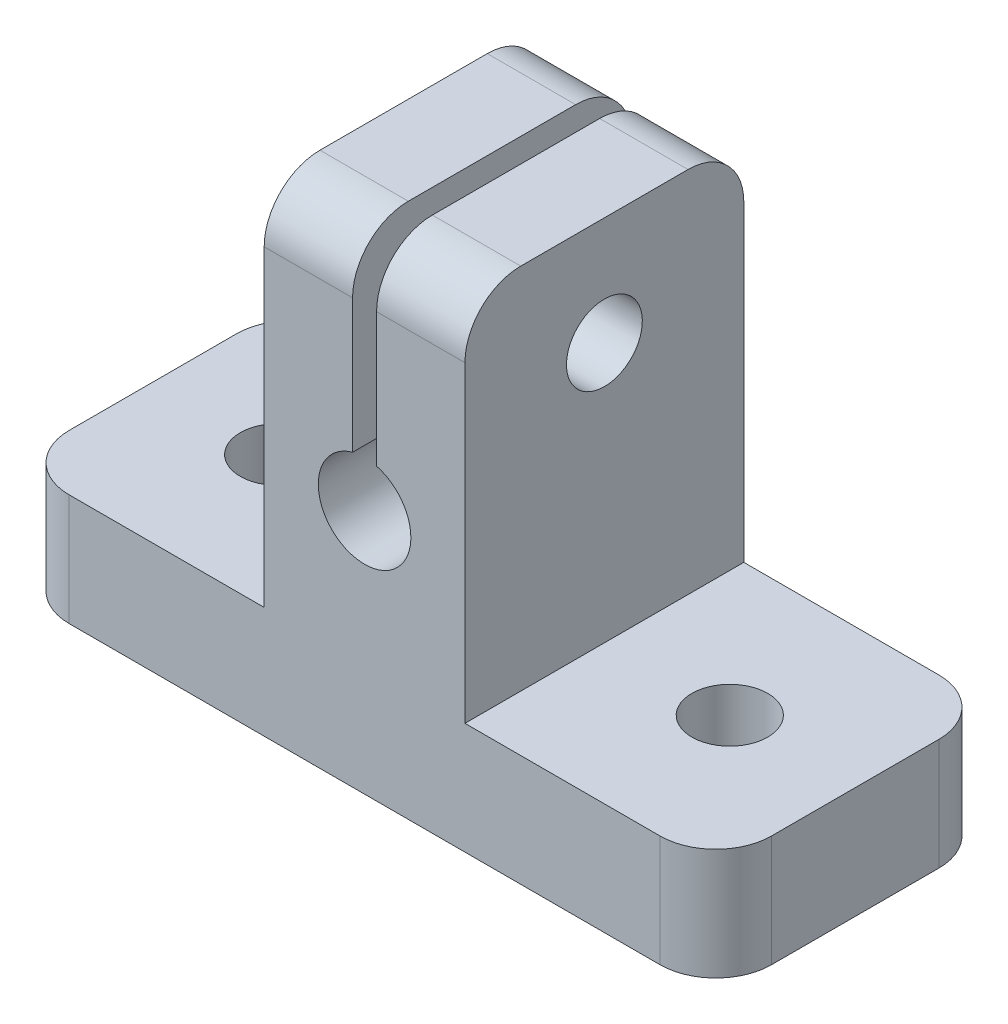
ISO-10303-21;
HEADER;
FILE_DESCRIPTION(('STEP AP214'),'2;1');
FILE_NAME('part.step','',(''),(''),'','','');
FILE_SCHEMA(('AUTOMOTIVE_DESIGN { 1 0 10303 214 1 1 1 1 }'));
ENDSEC;
DATA;
#1=APPLICATION_CONTEXT('core data for automotive mechanical design processes');
#2=APPLICATION_PROTOCOL_DEFINITION('international standard','automotive_design',2000,#1);
#3=PRODUCT_CONTEXT('',#1,'mechanical');
#4=PRODUCT('Part','Part','',(#3));
#5=PRODUCT_RELATED_PRODUCT_CATEGORY('part','',(#4));
#6=PRODUCT_DEFINITION_FORMATION('','',#4);
#7=PRODUCT_DEFINITION_CONTEXT('part definition',#1,'design');
#8=PRODUCT_DEFINITION('design','',#6,#7);
#9=PRODUCT_DEFINITION_SHAPE('','',#8);
#10=(LENGTH_UNIT() NAMED_UNIT(*) SI_UNIT(.MILLI.,.METRE.));
#11=(NAMED_UNIT(*) PLANE_ANGLE_UNIT() SI_UNIT($,.RADIAN.));
#12=(NAMED_UNIT(*) SI_UNIT($,.STERADIAN.) SOLID_ANGLE_UNIT());
#13=UNCERTAINTY_MEASURE_WITH_UNIT(LENGTH_MEASURE(1.E-05),#10,'distance_accuracy_value','');
#14=(GEOMETRIC_REPRESENTATION_CONTEXT(3) GLOBAL_UNCERTAINTY_ASSIGNED_CONTEXT((#13)) GLOBAL_UNIT_ASSIGNED_CONTEXT((#10,
#11,#12)) REPRESENTATION_CONTEXT('',''));
#15=CARTESIAN_POINT('',(0.,0.,0.));
#16=DIRECTION('',(0.,0.,1.));
#17=DIRECTION('',(1.,0.,0.));
#18=AXIS2_PLACEMENT_3D('',#15,#16,#17);
#19=CARTESIAN_POINT('',(-24.3883407876345,12.1310866110884,25.));
#20=DIRECTION('',(0.,-1.,0.));
#21=DIRECTION('',(1.,0.,0.));
#22=AXIS2_PLACEMENT_3D('',#19,#20,#21);
#23=PLANE('',#22);
#24=DIRECTION('',(0.,0.,-1.));
#25=VECTOR('',#24,1.);
#26=CARTESIAN_POINT('',(-24.3883407876345,12.1310866110884,25.));
#27=LINE('',#26,#25);
#28=CARTESIAN_POINT('',(-24.3883407876345,12.1310866110884,20.));
#29=VERTEX_POINT('',#28);
#30=CARTESIAN_POINT('',(-24.3883407876345,12.1310866110884,5.));
#31=VERTEX_POINT('',#30);
#32=EDGE_CURVE('E235',#29,#31,#27,.T.);
#33=ORIENTED_EDGE('',*,*,#32,.T.);
#34=DIRECTION('',(-1.,0.,0.));
#35=VECTOR('',#34,1.);
#36=CARTESIAN_POINT('',(-24.3883407876345,12.1310866110884,5.));
#37=LINE('',#36,#35);
#38=CARTESIAN_POINT('',(-32.31078029924,12.1310866110884,5.00000000000002));
#39=VERTEX_POINT('',#38);
#40=EDGE_CURVE('E307',#31,#39,#37,.T.);
#41=ORIENTED_EDGE('',*,*,#40,.T.);
#42=DIRECTION('',(0.,0.,-1.));
#43=VECTOR('',#42,1.);
#44=CARTESIAN_POINT('',(-32.31078029924,12.1310866110884,42.1284576157842));
#45=LINE('',#44,#43);
#46=CARTESIAN_POINT('',(-32.31078029924,12.1310866110884,20.));
#47=VERTEX_POINT('',#46);
#48=EDGE_CURVE('E347',#47,#39,#45,.T.);
#49=ORIENTED_EDGE('',*,*,#48,.F.);
#50=DIRECTION('',(-1.,0.,0.));
#51=VECTOR('',#50,1.);
#52=CARTESIAN_POINT('',(-24.3883407876345,12.1310866110884,20.));
#53=LINE('',#52,#51);
#54=EDGE_CURVE('E305',#47,#29,#53,.F.);
#55=ORIENTED_EDGE('',*,*,#54,.T.);
#56=EDGE_LOOP('',(#33,#41,#49,#55));
#57=FACE_BOUND('',#56,.T.);
#58=ADVANCED_FACE('F33',(#57),#23,.F.);
#59=DIRECTION('',(0.,0.,-1.));
#60=VECTOR('',#59,1.);
#61=CARTESIAN_POINT('',(-34.4659012760289,12.1310866110884,42.1284576157842));
#62=LINE('',#61,#60);
#63=CARTESIAN_POINT('',(-34.4659012760289,12.1310866110884,20.));
#64=VERTEX_POINT('',#63);
#65=CARTESIAN_POINT('',(-34.4659012760289,12.1310866110884,5.00000000000002));
#66=VERTEX_POINT('',#65);
#67=EDGE_CURVE('E329',#64,#66,#62,.T.);
#68=ORIENTED_EDGE('',*,*,#67,.T.);
#69=DIRECTION('',(-1.,0.,0.));
#70=VECTOR('',#69,1.);
#71=CARTESIAN_POINT('',(-24.3883407876345,12.1310866110884,5.));
#72=LINE('',#71,#70);
#73=CARTESIAN_POINT('',(-42.3883407876345,12.1310866110884,5.));
#74=VERTEX_POINT('',#73);
#75=EDGE_CURVE('E320',#66,#74,#72,.T.);
#76=ORIENTED_EDGE('',*,*,#75,.T.);
#77=DIRECTION('',(0.,0.,-1.));
#78=VECTOR('',#77,1.);
#79=CARTESIAN_POINT('',(-42.3883407876345,12.1310866110884,25.));
#80=LINE('',#79,#78);
#81=CARTESIAN_POINT('',(-42.3883407876345,12.1310866110884,20.));
#82=VERTEX_POINT('',#81);
#83=EDGE_CURVE('E222',#82,#74,#80,.T.);
#84=ORIENTED_EDGE('',*,*,#83,.F.);
#85=DIRECTION('',(-1.,0.,0.));
#86=VECTOR('',#85,1.);
#87=CARTESIAN_POINT('',(-34.4659012760289,12.1310866110884,20.));
#88=LINE('',#87,#86);
#89=EDGE_CURVE('E318',#82,#64,#88,.F.);
#90=ORIENTED_EDGE('',*,*,#89,.T.);
#91=EDGE_LOOP('',(#68,#76,#84,#90));
#92=FACE_BOUND('',#91,.T.);
#93=ADVANCED_FACE('F336',(#92),#23,.F.);
#94=CARTESIAN_POINT('',(0.,0.,25.));
#95=DIRECTION('',(0.,0.,1.));
#96=DIRECTION('',(1.,0.,0.));
#97=AXIS2_PLACEMENT_3D('',#94,#95,#96);
#98=PLANE('',#97);
#99=DIRECTION('',(1.,0.,0.));
#100=VECTOR('',#99,1.);
#101=CARTESIAN_POINT('',(-1.90219100004002,-30.8689133889115,25.));
#102=LINE('',#101,#100);
#103=CARTESIAN_POINT('',(-59.8744905752289,-30.8689133889116,25.));
#104=VERTEX_POINT('',#103);
#105=CARTESIAN_POINT('',(-6.90219100004002,-30.8689133889115,25.));
#106=VERTEX_POINT('',#105);
#107=EDGE_CURVE('E216',#104,#106,#102,.T.);
#108=ORIENTED_EDGE('',*,*,#107,.T.);
#109=DIRECTION('',(0.,1.,0.));
#110=VECTOR('',#109,1.);
#111=CARTESIAN_POINT('',(-6.90219100004002,-20.8689133889115,25.));
#112=LINE('',#111,#110);
#113=CARTESIAN_POINT('',(-6.90219100004002,-20.8689133889115,25.));
#114=VERTEX_POINT('',#113);
#115=EDGE_CURVE('E268',#106,#114,#112,.T.);
#116=ORIENTED_EDGE('',*,*,#115,.T.);
#117=DIRECTION('',(-1.,0.,0.));
#118=VECTOR('',#117,1.);
#119=CARTESIAN_POINT('',(-1.90219100004002,-20.8689133889115,25.));
#120=LINE('',#119,#118);
#121=CARTESIAN_POINT('',(-24.3883407876345,-20.8689133889116,25.));
#122=VERTEX_POINT('',#121);
#123=EDGE_CURVE('E218',#114,#122,#120,.T.);
#124=ORIENTED_EDGE('',*,*,#123,.T.);
#125=DIRECTION('',(0.,1.,0.));
#126=VECTOR('',#125,1.);
#127=CARTESIAN_POINT('',(-24.3883407876345,-20.8689133889116,25.));
#128=LINE('',#127,#126);
#129=CARTESIAN_POINT('',(-24.3883407876345,7.13108661108843,25.));
#130=VERTEX_POINT('',#129);
#131=EDGE_CURVE('E220',#122,#130,#128,.T.);
#132=ORIENTED_EDGE('',*,*,#131,.T.);
#133=DIRECTION('',(-1.,0.,0.));
#134=VECTOR('',#133,1.);
#135=CARTESIAN_POINT('',(-32.31078029924,7.13108661108843,25.));
#136=LINE('',#135,#134);
#137=CARTESIAN_POINT('',(-32.31078029924,7.13108661108843,25.));
#138=VERTEX_POINT('',#137);
#139=EDGE_CURVE('E193',#130,#138,#136,.T.);
#140=ORIENTED_EDGE('',*,*,#139,.T.);
#141=DIRECTION('',(0.,1.,0.));
#142=VECTOR('',#141,1.);
#143=CARTESIAN_POINT('',(-32.31078029924,-4.861250305037,25.));
#144=LINE('',#143,#142);
#145=CARTESIAN_POINT('',(-32.31078029924,-4.861250305037,25.));
#146=VERTEX_POINT('',#145);
#147=EDGE_CURVE('E175',#146,#138,#144,.T.);
#148=ORIENTED_EDGE('',*,*,#147,.F.);
#149=CARTESIAN_POINT('',(-33.3883407876345,-8.86891338891158,25.));
#150=DIRECTION('',(0.,0.,1.));
#151=DIRECTION('',(1.,0.,0.));
#152=AXIS2_PLACEMENT_3D('',#149,#150,#151);
#153=CIRCLE('',#152,4.15);
#154=CARTESIAN_POINT('',(-34.465901276029,-4.861250305037,25.));
#155=VERTEX_POINT('',#154);
#156=EDGE_CURVE('E190',#155,#146,#153,.T.);
#157=ORIENTED_EDGE('',*,*,#156,.F.);
#158=DIRECTION('',(0.,-1.,0.));
#159=VECTOR('',#158,1.);
#160=CARTESIAN_POINT('',(-34.4659012760289,-4.861250305037,25.));
#161=LINE('',#160,#159);
#162=CARTESIAN_POINT('',(-34.4659012760289,7.13108661108843,25.));
#163=VERTEX_POINT('',#162);
#164=EDGE_CURVE('E195',#163,#155,#161,.T.);
#165=ORIENTED_EDGE('',*,*,#164,.F.);
#166=DIRECTION('',(-1.,0.,0.));
#167=VECTOR('',#166,1.);
#168=CARTESIAN_POINT('',(-42.3883407876345,7.13108661108843,25.));
#169=LINE('',#168,#167);
#170=CARTESIAN_POINT('',(-42.3883407876345,7.13108661108843,25.));
#171=VERTEX_POINT('',#170);
#172=EDGE_CURVE('E256',#163,#171,#169,.T.);
#173=ORIENTED_EDGE('',*,*,#172,.T.);
#174=DIRECTION('',(0.,-1.,0.));
#175=VECTOR('',#174,1.);
#176=CARTESIAN_POINT('',(-42.3883407876345,-20.8689133889116,25.));
#177=LINE('',#176,#175);
#178=CARTESIAN_POINT('',(-42.3883407876345,-20.8689133889116,25.));
#179=VERTEX_POINT('',#178);
#180=EDGE_CURVE('E210',#171,#179,#177,.T.);
#181=ORIENTED_EDGE('',*,*,#180,.T.);
#182=DIRECTION('',(-1.,0.,0.));
#183=VECTOR('',#182,1.);
#184=CARTESIAN_POINT('',(-42.3883407876345,-20.8689133889116,25.));
#185=LINE('',#184,#183);
#186=CARTESIAN_POINT('',(-59.8744905752289,-20.8689133889116,25.));
#187=VERTEX_POINT('',#186);
#188=EDGE_CURVE('E212',#179,#187,#185,.T.);
#189=ORIENTED_EDGE('',*,*,#188,.T.);
#190=DIRECTION('',(0.,-1.,0.));
#191=VECTOR('',#190,1.);
#192=CARTESIAN_POINT('',(-59.8744905752289,-30.8689133889116,25.));
#193=LINE('',#192,#191);
#194=EDGE_CURVE('E265',#187,#104,#193,.T.);
#195=ORIENTED_EDGE('',*,*,#194,.T.);
#196=EDGE_LOOP('',(#108,#116,#124,#132,#140,#148,#157,#165,#173,#181,#189,#195));
#197=FACE_BOUND('',#196,.T.);
#198=ADVANCED_FACE('F188',(#197),#98,.T.);
#199=CARTESIAN_POINT('',(0.,0.,0.));
#200=DIRECTION('',(0.,0.,1.));
#201=DIRECTION('',(1.,0.,0.));
#202=AXIS2_PLACEMENT_3D('',#199,#200,#201);
#203=PLANE('',#202);
#204=DIRECTION('',(-1.,0.,0.));
#205=VECTOR('',#204,1.);
#206=CARTESIAN_POINT('',(-1.90219100004002,-20.8689133889115,0.));
#207=LINE('',#206,#205);
#208=CARTESIAN_POINT('',(-6.90219100004002,-20.8689133889115,0.));
#209=VERTEX_POINT('',#208);
#210=CARTESIAN_POINT('',(-24.3883407876345,-20.8689133889116,0.));
#211=VERTEX_POINT('',#210);
#212=EDGE_CURVE('E230',#209,#211,#207,.T.);
#213=ORIENTED_EDGE('',*,*,#212,.F.);
#214=DIRECTION('',(0.,1.,0.));
#215=VECTOR('',#214,1.);
#216=CARTESIAN_POINT('',(-6.90219100004002,0.,0.));
#217=LINE('',#216,#215);
#218=CARTESIAN_POINT('',(-6.90219100004002,-30.8689133889115,0.));
#219=VERTEX_POINT('',#218);
#220=EDGE_CURVE('E294',#209,#219,#217,.F.);
#221=ORIENTED_EDGE('',*,*,#220,.T.);
#222=DIRECTION('',(1.,0.,0.));
#223=VECTOR('',#222,1.);
#224=CARTESIAN_POINT('',(-1.90219100004002,-30.8689133889115,0.));
#225=LINE('',#224,#223);
#226=CARTESIAN_POINT('',(-59.8744905752289,-30.8689133889116,0.));
#227=VERTEX_POINT('',#226);
#228=EDGE_CURVE('E227',#227,#219,#225,.T.);
#229=ORIENTED_EDGE('',*,*,#228,.F.);
#230=DIRECTION('',(0.,-1.,0.));
#231=VECTOR('',#230,1.);
#232=CARTESIAN_POINT('',(-59.8744905752289,0.,0.));
#233=LINE('',#232,#231);
#234=CARTESIAN_POINT('',(-59.8744905752289,-20.8689133889116,0.));
#235=VERTEX_POINT('',#234);
#236=EDGE_CURVE('E292',#227,#235,#233,.F.);
#237=ORIENTED_EDGE('',*,*,#236,.T.);
#238=DIRECTION('',(-1.,0.,0.));
#239=VECTOR('',#238,1.);
#240=CARTESIAN_POINT('',(-42.3883407876345,-20.8689133889116,0.));
#241=LINE('',#240,#239);
#242=CARTESIAN_POINT('',(-42.3883407876345,-20.8689133889116,0.));
#243=VERTEX_POINT('',#242);
#244=EDGE_CURVE('E224',#243,#235,#241,.T.);
#245=ORIENTED_EDGE('',*,*,#244,.F.);
#246=DIRECTION('',(0.,-1.,0.));
#247=VECTOR('',#246,1.);
#248=CARTESIAN_POINT('',(-42.3883407876345,-20.8689133889116,0.));
#249=LINE('',#248,#247);
#250=CARTESIAN_POINT('',(-42.3883407876345,7.13108661108843,0.));
#251=VERTEX_POINT('',#250);
#252=EDGE_CURVE('E203',#251,#243,#249,.T.);
#253=ORIENTED_EDGE('',*,*,#252,.F.);
#254=DIRECTION('',(-1.,0.,0.));
#255=VECTOR('',#254,1.);
#256=CARTESIAN_POINT('',(0.,7.13108661108843,0.));
#257=LINE('',#256,#255);
#258=CARTESIAN_POINT('',(-34.4659012760289,7.13108661108843,0.));
#259=VERTEX_POINT('',#258);
#260=EDGE_CURVE('E288',#251,#259,#257,.F.);
#261=ORIENTED_EDGE('',*,*,#260,.T.);
#262=DIRECTION('',(0.,-1.,0.));
#263=VECTOR('',#262,1.);
#264=CARTESIAN_POINT('',(-34.4659012760289,-4.861250305037,0.));
#265=LINE('',#264,#263);
#266=CARTESIAN_POINT('',(-34.4659012760289,-4.861250305037,0.));
#267=VERTEX_POINT('',#266);
#268=EDGE_CURVE('E333',#259,#267,#265,.T.);
#269=ORIENTED_EDGE('',*,*,#268,.T.);
#270=CARTESIAN_POINT('',(-33.3883407876345,-8.86891338891158,0.));
#271=DIRECTION('',(0.,0.,1.));
#272=DIRECTION('',(1.,0.,0.));
#273=AXIS2_PLACEMENT_3D('',#270,#271,#272);
#274=CIRCLE('',#273,4.15);
#275=CARTESIAN_POINT('',(-32.31078029924,-4.861250305037,0.));
#276=VERTEX_POINT('',#275);
#277=EDGE_CURVE('E200',#276,#267,#274,.F.);
#278=ORIENTED_EDGE('',*,*,#277,.F.);
#279=DIRECTION('',(0.,1.,0.));
#280=VECTOR('',#279,1.);
#281=CARTESIAN_POINT('',(-32.31078029924,-4.861250305037,0.));
#282=LINE('',#281,#280);
#283=CARTESIAN_POINT('',(-32.31078029924,7.13108661108843,0.));
#284=VERTEX_POINT('',#283);
#285=EDGE_CURVE('E177',#276,#284,#282,.T.);
#286=ORIENTED_EDGE('',*,*,#285,.T.);
#287=DIRECTION('',(-1.,0.,0.));
#288=VECTOR('',#287,1.);
#289=CARTESIAN_POINT('',(0.,7.13108661108843,0.));
#290=LINE('',#289,#288);
#291=CARTESIAN_POINT('',(-24.3883407876345,7.13108661108843,0.));
#292=VERTEX_POINT('',#291);
#293=EDGE_CURVE('E290',#284,#292,#290,.F.);
#294=ORIENTED_EDGE('',*,*,#293,.T.);
#295=DIRECTION('',(0.,1.,0.));
#296=VECTOR('',#295,1.);
#297=CARTESIAN_POINT('',(-24.3883407876345,-20.8689133889116,0.));
#298=LINE('',#297,#296);
#299=EDGE_CURVE('E213',#211,#292,#298,.T.);
#300=ORIENTED_EDGE('',*,*,#299,.F.);
#301=EDGE_LOOP('',(#213,#221,#229,#237,#245,#253,#261,#269,#278,#286,#294,#300));
#302=FACE_BOUND('',#301,.T.);
#303=ADVANCED_FACE('F343',(#302),#203,.F.);
#304=CARTESIAN_POINT('',(-33.3883407876345,-8.86891338891158,-11.7379725676967));
#305=DIRECTION('',(0.,0.,1.));
#306=DIRECTION('',(1.,0.,0.));
#307=AXIS2_PLACEMENT_3D('',#304,#305,#306);
#308=CYLINDRICAL_SURFACE('',#307,4.15);
#309=DIRECTION('',(0.,0.,-1.));
#310=VECTOR('',#309,1.);
#311=CARTESIAN_POINT('',(-32.31078029924,-4.861250305037,42.1284576157842));
#312=LINE('',#311,#310);
#313=EDGE_CURVE('E171',#146,#276,#312,.T.);
#314=ORIENTED_EDGE('',*,*,#313,.T.);
#315=ORIENTED_EDGE('',*,*,#277,.T.);
#316=DIRECTION('',(0.,0.,-1.));
#317=VECTOR('',#316,1.);
#318=CARTESIAN_POINT('',(-34.4659012760289,-4.861250305037,42.1284576157842));
#319=LINE('',#318,#317);
#320=EDGE_CURVE('E182',#155,#267,#319,.T.);
#321=ORIENTED_EDGE('',*,*,#320,.F.);
#322=ORIENTED_EDGE('',*,*,#156,.T.);
#323=EDGE_LOOP('',(#314,#315,#321,#322));
#324=FACE_BOUND('',#323,.T.);
#325=ADVANCED_FACE('F198',(#324),#308,.F.);
#326=CARTESIAN_POINT('',(-42.3883407876345,-20.8689133889116,25.));
#327=DIRECTION('',(1.,0.,0.));
#328=DIRECTION('',(0.,1.,0.));
#329=AXIS2_PLACEMENT_3D('',#326,#327,#328);
#330=PLANE('',#329);
#331=CARTESIAN_POINT('',(-42.3883407876345,2.4236703066396,12.5));
#332=DIRECTION('',(-1.,0.,0.));
#333=DIRECTION('',(0.,-1.,0.));
#334=AXIS2_PLACEMENT_3D('',#331,#332,#333);
#335=CIRCLE('',#334,3.4);
#336=CARTESIAN_POINT('',(-42.3883407876345,-0.976329693360397,12.5));
#337=VERTEX_POINT('',#336);
#338=EDGE_CURVE('E646',#337,#337,#335,.T.);
#339=ORIENTED_EDGE('',*,*,#338,.F.);
#340=EDGE_LOOP('',(#339));
#341=FACE_BOUND('',#340,.T.);
#342=ORIENTED_EDGE('',*,*,#83,.T.);
#343=CARTESIAN_POINT('',(-42.3883407876345,7.13108661108843,5.));
#344=DIRECTION('',(1.,0.,0.));
#345=DIRECTION('',(0.,1.,0.));
#346=AXIS2_PLACEMENT_3D('',#343,#344,#345);
#347=CIRCLE('',#346,5.);
#348=EDGE_CURVE('E48',#74,#251,#347,.F.);
#349=ORIENTED_EDGE('',*,*,#348,.T.);
#350=ORIENTED_EDGE('',*,*,#252,.T.);
#351=DIRECTION('',(0.,0.,-1.));
#352=VECTOR('',#351,1.);
#353=CARTESIAN_POINT('',(-42.3883407876345,-20.8689133889116,25.));
#354=LINE('',#353,#352);
#355=EDGE_CURVE('E253',#179,#243,#354,.T.);
#356=ORIENTED_EDGE('',*,*,#355,.F.);
#357=ORIENTED_EDGE('',*,*,#180,.F.);
#358=CARTESIAN_POINT('',(-42.3883407876345,7.13108661108843,20.));
#359=DIRECTION('',(1.,0.,0.));
#360=DIRECTION('',(0.,1.,0.));
#361=AXIS2_PLACEMENT_3D('',#358,#359,#360);
#362=CIRCLE('',#361,5.);
#363=EDGE_CURVE('E56',#171,#82,#362,.F.);
#364=ORIENTED_EDGE('',*,*,#363,.T.);
#365=EDGE_LOOP('',(#342,#349,#350,#356,#357,#364));
#366=FACE_BOUND('',#365,.T.);
#367=ADVANCED_FACE('F337',(#341,#366),#330,.F.);
#368=CARTESIAN_POINT('',(-42.3883407876345,-20.8689133889116,25.));
#369=DIRECTION('',(0.,-1.,0.));
#370=DIRECTION('',(1.,0.,0.));
#371=AXIS2_PLACEMENT_3D('',#368,#369,#370);
#372=PLANE('',#371);
#373=CARTESIAN_POINT('',(-53.6314156814316,-20.8689133889116,12.5));
#374=DIRECTION('',(0.,1.,0.));
#375=DIRECTION('',(-1.,0.,0.));
#376=AXIS2_PLACEMENT_3D('',#373,#374,#375);
#377=CIRCLE('',#376,3.4);
#378=CARTESIAN_POINT('',(-57.0314156814316,-20.8689133889116,12.5));
#379=VERTEX_POINT('',#378);
#380=EDGE_CURVE('E194',#379,#379,#377,.T.);
#381=ORIENTED_EDGE('',*,*,#380,.F.);
#382=EDGE_LOOP('',(#381));
#383=FACE_BOUND('',#382,.T.);
#384=DIRECTION('',(0.,0.,-1.));
#385=VECTOR('',#384,1.);
#386=CARTESIAN_POINT('',(-64.8744905752289,-20.8689133889116,25.));
#387=LINE('',#386,#385);
#388=CARTESIAN_POINT('',(-64.8744905752289,-20.8689133889116,20.));
#389=VERTEX_POINT('',#388);
#390=CARTESIAN_POINT('',(-64.8744905752289,-20.8689133889116,5.));
#391=VERTEX_POINT('',#390);
#392=EDGE_CURVE('E250',#389,#391,#387,.T.);
#393=ORIENTED_EDGE('',*,*,#392,.F.);
#394=CARTESIAN_POINT('',(-59.8744905752289,-20.8689133889116,20.));
#395=DIRECTION('',(0.,-1.,0.));
#396=DIRECTION('',(1.,0.,0.));
#397=AXIS2_PLACEMENT_3D('',#394,#395,#396);
#398=CIRCLE('',#397,5.);
#399=EDGE_CURVE('E303',#389,#187,#398,.F.);
#400=ORIENTED_EDGE('',*,*,#399,.T.);
#401=ORIENTED_EDGE('',*,*,#188,.F.);
#402=ORIENTED_EDGE('',*,*,#355,.T.);
#403=ORIENTED_EDGE('',*,*,#244,.T.);
#404=CARTESIAN_POINT('',(-59.8744905752289,-20.8689133889116,5.));
#405=DIRECTION('',(0.,-1.,0.));
#406=DIRECTION('',(1.,0.,0.));
#407=AXIS2_PLACEMENT_3D('',#404,#405,#406);
#408=CIRCLE('',#407,5.);
#409=EDGE_CURVE('E301',#235,#391,#408,.F.);
#410=ORIENTED_EDGE('',*,*,#409,.T.);
#411=EDGE_LOOP('',(#393,#400,#401,#402,#403,#410));
#412=FACE_BOUND('',#411,.T.);
#413=ADVANCED_FACE('F429',(#383,#412),#372,.F.);
#414=CARTESIAN_POINT('',(-64.8744905752289,-30.8689133889116,25.));
#415=DIRECTION('',(1.,0.,0.));
#416=DIRECTION('',(0.,1.,0.));
#417=AXIS2_PLACEMENT_3D('',#414,#415,#416);
#418=PLANE('',#417);
#419=DIRECTION('',(0.,0.,-1.));
#420=VECTOR('',#419,1.);
#421=CARTESIAN_POINT('',(-64.8744905752289,-30.8689133889116,25.));
#422=LINE('',#421,#420);
#423=CARTESIAN_POINT('',(-64.8744905752289,-30.8689133889116,20.));
#424=VERTEX_POINT('',#423);
#425=CARTESIAN_POINT('',(-64.8744905752289,-30.8689133889116,5.));
#426=VERTEX_POINT('',#425);
#427=EDGE_CURVE('E247',#424,#426,#422,.T.);
#428=ORIENTED_EDGE('',*,*,#427,.F.);
#429=DIRECTION('',(0.,-1.,0.));
#430=VECTOR('',#429,1.);
#431=CARTESIAN_POINT('',(-64.8744905752289,-20.8689133889116,20.));
#432=LINE('',#431,#430);
#433=EDGE_CURVE('E299',#424,#389,#432,.F.);
#434=ORIENTED_EDGE('',*,*,#433,.T.);
#435=ORIENTED_EDGE('',*,*,#392,.T.);
#436=DIRECTION('',(0.,-1.,0.));
#437=VECTOR('',#436,1.);
#438=CARTESIAN_POINT('',(-64.8744905752289,-30.8689133889116,5.));
#439=LINE('',#438,#437);
#440=EDGE_CURVE('E296',#391,#426,#439,.T.);
#441=ORIENTED_EDGE('',*,*,#440,.T.);
#442=EDGE_LOOP('',(#428,#434,#435,#441));
#443=FACE_BOUND('',#442,.T.);
#444=ADVANCED_FACE('F425',(#443),#418,.F.);
#445=CARTESIAN_POINT('',(-1.90219100004002,-30.8689133889115,25.));
#446=DIRECTION('',(0.,1.,0.));
#447=DIRECTION('',(-1.,0.,0.));
#448=AXIS2_PLACEMENT_3D('',#445,#446,#447);
#449=PLANE('',#448);
#450=CARTESIAN_POINT('',(-53.6314156814316,-30.8689133889116,12.5));
#451=DIRECTION('',(0.,1.,0.));
#452=DIRECTION('',(-1.,0.,0.));
#453=AXIS2_PLACEMENT_3D('',#450,#451,#452);
#454=CIRCLE('',#453,3.4);
#455=CARTESIAN_POINT('',(-57.0314156814316,-30.8689133889116,12.5));
#456=VERTEX_POINT('',#455);
#457=EDGE_CURVE('E357',#456,#456,#454,.F.);
#458=ORIENTED_EDGE('',*,*,#457,.F.);
#459=EDGE_LOOP('',(#458));
#460=FACE_BOUND('',#459,.T.);
#461=CARTESIAN_POINT('',(-13.1452658938372,-30.8689133889115,12.5));
#462=DIRECTION('',(0.,1.,0.));
#463=DIRECTION('',(-1.,0.,0.));
#464=AXIS2_PLACEMENT_3D('',#461,#462,#463);
#465=CIRCLE('',#464,3.4);
#466=CARTESIAN_POINT('',(-16.5452658938372,-30.8689133889116,12.5));
#467=VERTEX_POINT('',#466);
#468=EDGE_CURVE('E201',#467,#467,#465,.F.);
#469=ORIENTED_EDGE('',*,*,#468,.F.);
#470=EDGE_LOOP('',(#469));
#471=FACE_BOUND('',#470,.T.);
#472=DIRECTION('',(0.,0.,-1.));
#473=VECTOR('',#472,1.);
#474=CARTESIAN_POINT('',(-1.90219100004002,-30.8689133889115,25.));
#475=LINE('',#474,#473);
#476=CARTESIAN_POINT('',(-1.90219100004002,-30.8689133889115,20.));
#477=VERTEX_POINT('',#476);
#478=CARTESIAN_POINT('',(-1.90219100004002,-30.8689133889115,5.));
#479=VERTEX_POINT('',#478);
#480=EDGE_CURVE('E244',#477,#479,#475,.T.);
#481=ORIENTED_EDGE('',*,*,#480,.F.);
#482=CARTESIAN_POINT('',(-6.90219100004002,-30.8689133889115,20.));
#483=DIRECTION('',(0.,1.,0.));
#484=DIRECTION('',(-1.,0.,0.));
#485=AXIS2_PLACEMENT_3D('',#482,#483,#484);
#486=CIRCLE('',#485,5.);
#487=EDGE_CURVE('E286',#477,#106,#486,.F.);
#488=ORIENTED_EDGE('',*,*,#487,.T.);
#489=ORIENTED_EDGE('',*,*,#107,.F.);
#490=CARTESIAN_POINT('',(-59.8744905752289,-30.8689133889116,20.));
#491=DIRECTION('',(0.,1.,0.));
#492=DIRECTION('',(-1.,0.,0.));
#493=AXIS2_PLACEMENT_3D('',#490,#491,#492);
#494=CIRCLE('',#493,5.);
#495=EDGE_CURVE('E282',#104,#424,#494,.F.);
#496=ORIENTED_EDGE('',*,*,#495,.T.);
#497=ORIENTED_EDGE('',*,*,#427,.T.);
#498=CARTESIAN_POINT('',(-59.8744905752289,-30.8689133889116,5.));
#499=DIRECTION('',(0.,1.,0.));
#500=DIRECTION('',(-1.,0.,0.));
#501=AXIS2_PLACEMENT_3D('',#498,#499,#500);
#502=CIRCLE('',#501,5.);
#503=EDGE_CURVE('E280',#426,#227,#502,.F.);
#504=ORIENTED_EDGE('',*,*,#503,.T.);
#505=ORIENTED_EDGE('',*,*,#228,.T.);
#506=CARTESIAN_POINT('',(-6.90219100004002,-30.8689133889115,5.));
#507=DIRECTION('',(0.,1.,0.));
#508=DIRECTION('',(-1.,0.,0.));
#509=AXIS2_PLACEMENT_3D('',#506,#507,#508);
#510=CIRCLE('',#509,5.);
#511=EDGE_CURVE('E284',#219,#479,#510,.F.);
#512=ORIENTED_EDGE('',*,*,#511,.T.);
#513=EDGE_LOOP('',(#481,#488,#489,#496,#497,#504,#505,#512));
#514=FACE_BOUND('',#513,.T.);
#515=ADVANCED_FACE('F384',(#460,#471,#514),#449,.F.);
#516=CARTESIAN_POINT('',(-1.90219100004002,-30.8689133889115,25.));
#517=DIRECTION('',(-1.,0.,0.));
#518=DIRECTION('',(0.,0.,1.));
#519=AXIS2_PLACEMENT_3D('',#516,#517,#518);
#520=PLANE('',#519);
#521=DIRECTION('',(0.,0.,-1.));
#522=VECTOR('',#521,1.);
#523=CARTESIAN_POINT('',(-1.90219100004002,-20.8689133889115,25.));
#524=LINE('',#523,#522);
#525=CARTESIAN_POINT('',(-1.90219100004002,-20.8689133889115,20.));
#526=VERTEX_POINT('',#525);
#527=CARTESIAN_POINT('',(-1.90219100004002,-20.8689133889115,5.));
#528=VERTEX_POINT('',#527);
#529=EDGE_CURVE('E241',#526,#528,#524,.T.);
#530=ORIENTED_EDGE('',*,*,#529,.F.);
#531=DIRECTION('',(0.,1.,0.));
#532=VECTOR('',#531,1.);
#533=CARTESIAN_POINT('',(-1.90219100004002,-30.8689133889115,20.));
#534=LINE('',#533,#532);
#535=EDGE_CURVE('E278',#526,#477,#534,.F.);
#536=ORIENTED_EDGE('',*,*,#535,.T.);
#537=ORIENTED_EDGE('',*,*,#480,.T.);
#538=DIRECTION('',(0.,1.,0.));
#539=VECTOR('',#538,1.);
#540=CARTESIAN_POINT('',(-1.90219100004002,-30.8689133889115,5.));
#541=LINE('',#540,#539);
#542=EDGE_CURVE('E275',#479,#528,#541,.T.);
#543=ORIENTED_EDGE('',*,*,#542,.T.);
#544=EDGE_LOOP('',(#530,#536,#537,#543));
#545=FACE_BOUND('',#544,.T.);
#546=ADVANCED_FACE('F368',(#545),#520,.F.);
#547=CARTESIAN_POINT('',(-1.90219100004002,-20.8689133889115,25.));
#548=DIRECTION('',(0.,-1.,0.));
#549=DIRECTION('',(1.,0.,0.));
#550=AXIS2_PLACEMENT_3D('',#547,#548,#549);
#551=PLANE('',#550);
#552=CARTESIAN_POINT('',(-13.1452658938372,-20.8689133889115,12.5));
#553=DIRECTION('',(0.,1.,0.));
#554=DIRECTION('',(-1.,0.,0.));
#555=AXIS2_PLACEMENT_3D('',#552,#553,#554);
#556=CIRCLE('',#555,3.4);
#557=CARTESIAN_POINT('',(-16.5452658938372,-20.8689133889116,12.5));
#558=VERTEX_POINT('',#557);
#559=EDGE_CURVE('E206',#558,#558,#556,.T.);
#560=ORIENTED_EDGE('',*,*,#559,.F.);
#561=EDGE_LOOP('',(#560));
#562=FACE_BOUND('',#561,.T.);
#563=ORIENTED_EDGE('',*,*,#123,.F.);
#564=CARTESIAN_POINT('',(-6.90219100004002,-20.8689133889115,20.));
#565=DIRECTION('',(0.,-1.,0.));
#566=DIRECTION('',(1.,0.,0.));
#567=AXIS2_PLACEMENT_3D('',#564,#565,#566);
#568=CIRCLE('',#567,5.);
#569=EDGE_CURVE('E273',#114,#526,#568,.F.);
#570=ORIENTED_EDGE('',*,*,#569,.T.);
#571=ORIENTED_EDGE('',*,*,#529,.T.);
#572=CARTESIAN_POINT('',(-6.90219100004002,-20.8689133889115,5.));
#573=DIRECTION('',(0.,-1.,0.));
#574=DIRECTION('',(1.,0.,0.));
#575=AXIS2_PLACEMENT_3D('',#572,#573,#574);
#576=CIRCLE('',#575,5.);
#577=EDGE_CURVE('E271',#528,#209,#576,.F.);
#578=ORIENTED_EDGE('',*,*,#577,.T.);
#579=ORIENTED_EDGE('',*,*,#212,.T.);
#580=DIRECTION('',(0.,0.,-1.));
#581=VECTOR('',#580,1.);
#582=CARTESIAN_POINT('',(-24.3883407876345,-20.8689133889116,25.));
#583=LINE('',#582,#581);
#584=EDGE_CURVE('E238',#122,#211,#583,.T.);
#585=ORIENTED_EDGE('',*,*,#584,.F.);
#586=EDGE_LOOP('',(#563,#570,#571,#578,#579,#585));
#587=FACE_BOUND('',#586,.T.);
#588=ADVANCED_FACE('F364',(#562,#587),#551,.F.);
#589=CARTESIAN_POINT('',(-24.3883407876345,-20.8689133889116,25.));
#590=DIRECTION('',(-1.,0.,0.));
#591=DIRECTION('',(0.,-1.,0.));
#592=AXIS2_PLACEMENT_3D('',#589,#590,#591);
#593=PLANE('',#592);
#594=CARTESIAN_POINT('',(-24.3883407876345,2.42367030663971,12.5));
#595=DIRECTION('',(-1.,0.,0.));
#596=DIRECTION('',(0.,-1.,0.));
#597=AXIS2_PLACEMENT_3D('',#594,#595,#596);
#598=CIRCLE('',#597,3.4);
#599=CARTESIAN_POINT('',(-24.3883407876345,-0.976329693360287,12.5));
#600=VERTEX_POINT('',#599);
#601=EDGE_CURVE('E261',#600,#600,#598,.F.);
#602=ORIENTED_EDGE('',*,*,#601,.F.);
#603=EDGE_LOOP('',(#602));
#604=FACE_BOUND('',#603,.T.);
#605=ORIENTED_EDGE('',*,*,#299,.T.);
#606=CARTESIAN_POINT('',(-24.3883407876345,7.13108661108843,5.));
#607=DIRECTION('',(-1.,0.,0.));
#608=DIRECTION('',(0.,-1.,0.));
#609=AXIS2_PLACEMENT_3D('',#606,#607,#608);
#610=CIRCLE('',#609,5.);
#611=EDGE_CURVE('E316',#292,#31,#610,.F.);
#612=ORIENTED_EDGE('',*,*,#611,.T.);
#613=ORIENTED_EDGE('',*,*,#32,.F.);
#614=CARTESIAN_POINT('',(-24.3883407876345,7.13108661108843,20.));
#615=DIRECTION('',(-1.,0.,0.));
#616=DIRECTION('',(0.,-1.,0.));
#617=AXIS2_PLACEMENT_3D('',#614,#615,#616);
#618=CIRCLE('',#617,5.);
#619=EDGE_CURVE('E314',#29,#130,#618,.F.);
#620=ORIENTED_EDGE('',*,*,#619,.T.);
#621=ORIENTED_EDGE('',*,*,#131,.F.);
#622=ORIENTED_EDGE('',*,*,#584,.T.);
#623=EDGE_LOOP('',(#605,#612,#613,#620,#621,#622));
#624=FACE_BOUND('',#623,.T.);
#625=ADVANCED_FACE('F367',(#604,#624),#593,.F.);
#626=CARTESIAN_POINT('',(-13.1452658938372,-40.4855656130486,12.5));
#627=DIRECTION('',(0.,1.,0.));
#628=DIRECTION('',(-1.,0.,0.));
#629=AXIS2_PLACEMENT_3D('',#626,#627,#628);
#630=CYLINDRICAL_SURFACE('',#629,3.4);
#631=ORIENTED_EDGE('',*,*,#468,.T.);
#632=EDGE_LOOP('',(#631));
#633=FACE_BOUND('',#632,.T.);
#634=ORIENTED_EDGE('',*,*,#559,.T.);
#635=EDGE_LOOP('',(#634));
#636=FACE_BOUND('',#635,.T.);
#637=ADVANCED_FACE('F362',(#633,#636),#630,.F.);
#638=CARTESIAN_POINT('',(-53.6314156814316,-40.4855656130486,12.5));
#639=DIRECTION('',(0.,1.,0.));
#640=DIRECTION('',(-1.,0.,0.));
#641=AXIS2_PLACEMENT_3D('',#638,#639,#640);
#642=CYLINDRICAL_SURFACE('',#641,3.4);
#643=ORIENTED_EDGE('',*,*,#457,.T.);
#644=EDGE_LOOP('',(#643));
#645=FACE_BOUND('',#644,.T.);
#646=ORIENTED_EDGE('',*,*,#380,.T.);
#647=EDGE_LOOP('',(#646));
#648=FACE_BOUND('',#647,.T.);
#649=ADVANCED_FACE('F525',(#645,#648),#642,.F.);
#650=CARTESIAN_POINT('',(-34.4659012760289,-4.861250305037,42.1284576157842));
#651=DIRECTION('',(1.,0.,0.));
#652=DIRECTION('',(0.,0.,-1.));
#653=AXIS2_PLACEMENT_3D('',#650,#651,#652);
#654=PLANE('',#653);
#655=CARTESIAN_POINT('',(-34.4659012760289,2.42367030663965,12.5));
#656=DIRECTION('',(1.,0.,0.));
#657=DIRECTION('',(0.,0.,-1.));
#658=AXIS2_PLACEMENT_3D('',#655,#656,#657);
#659=CIRCLE('',#658,3.4);
#660=CARTESIAN_POINT('',(-34.4659012760289,2.42367030663965,9.1));
#661=VERTEX_POINT('',#660);
#662=EDGE_CURVE('E260',#661,#661,#659,.T.);
#663=ORIENTED_EDGE('',*,*,#662,.F.);
#664=EDGE_LOOP('',(#663));
#665=FACE_BOUND('',#664,.T.);
#666=ORIENTED_EDGE('',*,*,#268,.F.);
#667=CARTESIAN_POINT('',(-34.4659012760289,7.13108661108843,5.));
#668=DIRECTION('',(1.,0.,0.));
#669=DIRECTION('',(0.,0.,-1.));
#670=AXIS2_PLACEMENT_3D('',#667,#668,#669);
#671=CIRCLE('',#670,5.);
#672=EDGE_CURVE('E11',#259,#66,#671,.T.);
#673=ORIENTED_EDGE('',*,*,#672,.T.);
#674=ORIENTED_EDGE('',*,*,#67,.F.);
#675=CARTESIAN_POINT('',(-34.4659012760289,7.13108661108843,20.));
#676=DIRECTION('',(1.,0.,0.));
#677=DIRECTION('',(0.,0.,-1.));
#678=AXIS2_PLACEMENT_3D('',#675,#676,#677);
#679=CIRCLE('',#678,5.);
#680=EDGE_CURVE('E41',#64,#163,#679,.T.);
#681=ORIENTED_EDGE('',*,*,#680,.T.);
#682=ORIENTED_EDGE('',*,*,#164,.T.);
#683=ORIENTED_EDGE('',*,*,#320,.T.);
#684=EDGE_LOOP('',(#666,#673,#674,#681,#682,#683));
#685=FACE_BOUND('',#684,.T.);
#686=ADVANCED_FACE('F327',(#665,#685),#654,.T.);
#687=CARTESIAN_POINT('',(-32.31078029924,-4.861250305037,42.1284576157842));
#688=DIRECTION('',(-1.,0.,0.));
#689=DIRECTION('',(0.,-1.,0.));
#690=AXIS2_PLACEMENT_3D('',#687,#688,#689);
#691=PLANE('',#690);
#692=CARTESIAN_POINT('',(-32.31078029924,2.42367030663966,12.5));
#693=DIRECTION('',(-1.,0.,0.));
#694=DIRECTION('',(0.,-1.,0.));
#695=AXIS2_PLACEMENT_3D('',#692,#693,#694);
#696=CIRCLE('',#695,3.4);
#697=CARTESIAN_POINT('',(-32.31078029924,-0.976329693360336,12.5));
#698=VERTEX_POINT('',#697);
#699=EDGE_CURVE('E257',#698,#698,#696,.T.);
#700=ORIENTED_EDGE('',*,*,#699,.F.);
#701=EDGE_LOOP('',(#700));
#702=FACE_BOUND('',#701,.T.);
#703=ORIENTED_EDGE('',*,*,#48,.T.);
#704=CARTESIAN_POINT('',(-32.31078029924,7.13108661108843,5.));
#705=DIRECTION('',(-1.,0.,0.));
#706=DIRECTION('',(0.,-1.,0.));
#707=AXIS2_PLACEMENT_3D('',#704,#705,#706);
#708=CIRCLE('',#707,5.);
#709=EDGE_CURVE('E312',#39,#284,#708,.T.);
#710=ORIENTED_EDGE('',*,*,#709,.T.);
#711=ORIENTED_EDGE('',*,*,#285,.F.);
#712=ORIENTED_EDGE('',*,*,#313,.F.);
#713=ORIENTED_EDGE('',*,*,#147,.T.);
#714=CARTESIAN_POINT('',(-32.31078029924,7.13108661108843,20.));
#715=DIRECTION('',(-1.,0.,0.));
#716=DIRECTION('',(0.,-1.,0.));
#717=AXIS2_PLACEMENT_3D('',#714,#715,#716);
#718=CIRCLE('',#717,5.);
#719=EDGE_CURVE('E310',#138,#47,#718,.T.);
#720=ORIENTED_EDGE('',*,*,#719,.T.);
#721=EDGE_LOOP('',(#703,#710,#711,#712,#713,#720));
#722=FACE_BOUND('',#721,.T.);
#723=ADVANCED_FACE('F174',(#702,#722),#691,.T.);
#724=CARTESIAN_POINT('',(-14.7716885634975,2.42367030663977,12.5));
#725=DIRECTION('',(-1.,0.,0.));
#726=DIRECTION('',(0.,-1.,0.));
#727=AXIS2_PLACEMENT_3D('',#724,#725,#726);
#728=CYLINDRICAL_SURFACE('',#727,3.4);
#729=ORIENTED_EDGE('',*,*,#699,.T.);
#730=EDGE_LOOP('',(#729));
#731=FACE_BOUND('',#730,.T.);
#732=ORIENTED_EDGE('',*,*,#601,.T.);
#733=EDGE_LOOP('',(#732));
#734=FACE_BOUND('',#733,.T.);
#735=ADVANCED_FACE('F501',(#731,#734),#728,.F.);
#736=ORIENTED_EDGE('',*,*,#662,.T.);
#737=EDGE_LOOP('',(#736));
#738=FACE_BOUND('',#737,.T.);
#739=ORIENTED_EDGE('',*,*,#338,.T.);
#740=EDGE_LOOP('',(#739));
#741=FACE_BOUND('',#740,.T.);
#742=ADVANCED_FACE('F439',(#738,#741),#728,.F.);
#743=CARTESIAN_POINT('',(-6.90219100004002,0.,20.));
#744=DIRECTION('',(0.,-1.,0.));
#745=DIRECTION('',(0.,0.,-1.));
#746=AXIS2_PLACEMENT_3D('',#743,#744,#745);
#747=CYLINDRICAL_SURFACE('',#746,5.);
#748=ORIENTED_EDGE('',*,*,#487,.F.);
#749=ORIENTED_EDGE('',*,*,#535,.F.);
#750=ORIENTED_EDGE('',*,*,#569,.F.);
#751=ORIENTED_EDGE('',*,*,#115,.F.);
#752=EDGE_LOOP('',(#748,#749,#750,#751));
#753=FACE_BOUND('',#752,.T.);
#754=ADVANCED_FACE('F378',(#753),#747,.T.);
#755=CARTESIAN_POINT('',(-6.90219100004002,-30.8689133889115,5.));
#756=DIRECTION('',(0.,1.,0.));
#757=DIRECTION('',(0.,0.,1.));
#758=AXIS2_PLACEMENT_3D('',#755,#756,#757);
#759=CYLINDRICAL_SURFACE('',#758,5.);
#760=ORIENTED_EDGE('',*,*,#511,.F.);
#761=ORIENTED_EDGE('',*,*,#220,.F.);
#762=ORIENTED_EDGE('',*,*,#577,.F.);
#763=ORIENTED_EDGE('',*,*,#542,.F.);
#764=EDGE_LOOP('',(#760,#761,#762,#763));
#765=FACE_BOUND('',#764,.T.);
#766=ADVANCED_FACE('F389',(#765),#759,.T.);
#767=CARTESIAN_POINT('',(-59.8744905752289,0.,20.));
#768=DIRECTION('',(0.,1.,0.));
#769=DIRECTION('',(-1.,0.,0.));
#770=AXIS2_PLACEMENT_3D('',#767,#768,#769);
#771=CYLINDRICAL_SURFACE('',#770,5.);
#772=ORIENTED_EDGE('',*,*,#399,.F.);
#773=ORIENTED_EDGE('',*,*,#433,.F.);
#774=ORIENTED_EDGE('',*,*,#495,.F.);
#775=ORIENTED_EDGE('',*,*,#194,.F.);
#776=EDGE_LOOP('',(#772,#773,#774,#775));
#777=FACE_BOUND('',#776,.T.);
#778=ADVANCED_FACE('F442',(#777),#771,.T.);
#779=CARTESIAN_POINT('',(-59.8744905752289,-30.8689133889116,5.));
#780=DIRECTION('',(0.,-1.,0.));
#781=DIRECTION('',(1.,0.,0.));
#782=AXIS2_PLACEMENT_3D('',#779,#780,#781);
#783=CYLINDRICAL_SURFACE('',#782,5.);
#784=ORIENTED_EDGE('',*,*,#409,.F.);
#785=ORIENTED_EDGE('',*,*,#236,.F.);
#786=ORIENTED_EDGE('',*,*,#503,.F.);
#787=ORIENTED_EDGE('',*,*,#440,.F.);
#788=EDGE_LOOP('',(#784,#785,#786,#787));
#789=FACE_BOUND('',#788,.T.);
#790=ADVANCED_FACE('F445',(#789),#783,.T.);
#791=CARTESIAN_POINT('',(-24.3883407876345,7.13108661108843,5.));
#792=DIRECTION('',(-1.,0.,0.));
#793=DIRECTION('',(0.,-1.,0.));
#794=AXIS2_PLACEMENT_3D('',#791,#792,#793);
#795=CYLINDRICAL_SURFACE('',#794,5.);
#796=ORIENTED_EDGE('',*,*,#611,.F.);
#797=ORIENTED_EDGE('',*,*,#293,.F.);
#798=ORIENTED_EDGE('',*,*,#709,.F.);
#799=ORIENTED_EDGE('',*,*,#40,.F.);
#800=EDGE_LOOP('',(#796,#797,#798,#799));
#801=FACE_BOUND('',#800,.T.);
#802=ADVANCED_FACE('F397',(#801),#795,.T.);
#803=CARTESIAN_POINT('',(-24.3883407876345,7.13108661108843,5.));
#804=DIRECTION('',(-1.,0.,0.));
#805=DIRECTION('',(0.,-1.,0.));
#806=AXIS2_PLACEMENT_3D('',#803,#804,#805);
#807=CYLINDRICAL_SURFACE('',#806,5.);
#808=ORIENTED_EDGE('',*,*,#672,.F.);
#809=ORIENTED_EDGE('',*,*,#260,.F.);
#810=ORIENTED_EDGE('',*,*,#348,.F.);
#811=ORIENTED_EDGE('',*,*,#75,.F.);
#812=EDGE_LOOP('',(#808,#809,#810,#811));
#813=FACE_BOUND('',#812,.T.);
#814=ADVANCED_FACE('F345',(#813),#807,.T.);
#815=CARTESIAN_POINT('',(0.,7.13108661108843,20.));
#816=DIRECTION('',(1.,0.,0.));
#817=DIRECTION('',(0.,1.,0.));
#818=AXIS2_PLACEMENT_3D('',#815,#816,#817);
#819=CYLINDRICAL_SURFACE('',#818,5.);
#820=ORIENTED_EDGE('',*,*,#619,.F.);
#821=ORIENTED_EDGE('',*,*,#54,.F.);
#822=ORIENTED_EDGE('',*,*,#719,.F.);
#823=ORIENTED_EDGE('',*,*,#139,.F.);
#824=EDGE_LOOP('',(#820,#821,#822,#823));
#825=FACE_BOUND('',#824,.T.);
#826=ADVANCED_FACE('F403',(#825),#819,.T.);
#827=CARTESIAN_POINT('',(0.,7.13108661108843,20.));
#828=DIRECTION('',(1.,0.,0.));
#829=DIRECTION('',(0.,1.,0.));
#830=AXIS2_PLACEMENT_3D('',#827,#828,#829);
#831=CYLINDRICAL_SURFACE('',#830,5.);
#832=ORIENTED_EDGE('',*,*,#680,.F.);
#833=ORIENTED_EDGE('',*,*,#89,.F.);
#834=ORIENTED_EDGE('',*,*,#363,.F.);
#835=ORIENTED_EDGE('',*,*,#172,.F.);
#836=EDGE_LOOP('',(#832,#833,#834,#835));
#837=FACE_BOUND('',#836,.T.);
#838=ADVANCED_FACE('F35',(#837),#831,.T.);
#839=CLOSED_SHELL('',(#58,#93,#198,#303,#325,#367,#413,#444,#515,#546,#588,#625,#637,#649,#686,
#723,#735,#742,#754,#766,#778,#790,#802,#814,#826,#838));
#840=MANIFOLD_SOLID_BREP('B2',#839);
#841=ADVANCED_BREP_SHAPE_REPRESENTATION('',(#18,#840),#14);
#842=SHAPE_DEFINITION_REPRESENTATION(#9,#841);
ENDSEC;
END-ISO-10303-21;
